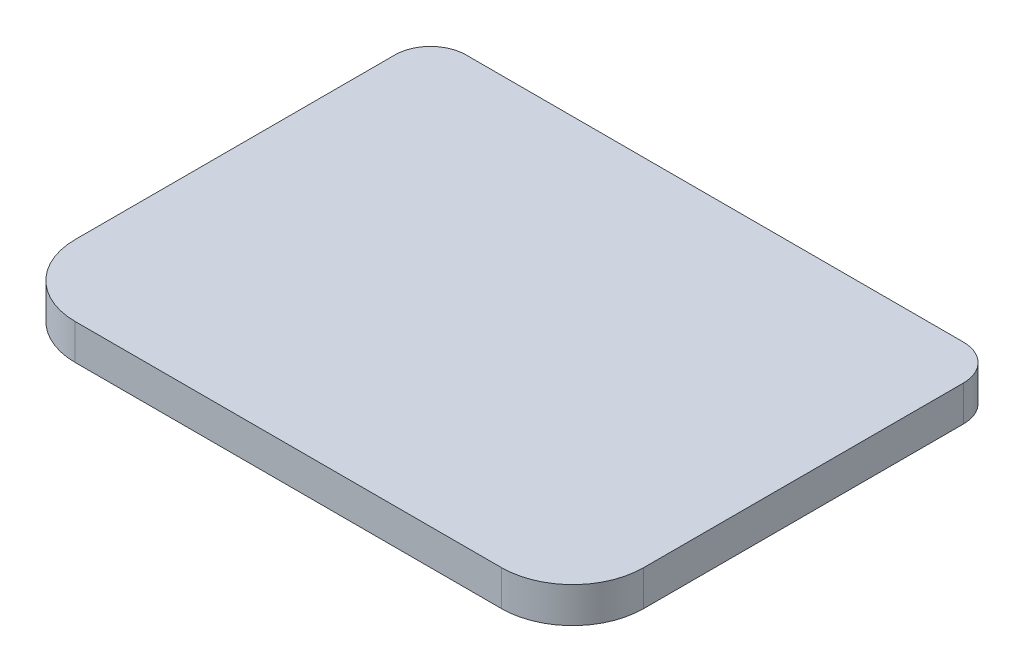
ISO-10303-21;
HEADER;
FILE_DESCRIPTION(('STEP AP214'),'2;1');
FILE_NAME('part.step','',(''),(''),'','','');
FILE_SCHEMA(('AUTOMOTIVE_DESIGN { 1 0 10303 214 1 1 1 1 }'));
ENDSEC;
DATA;
#1=APPLICATION_CONTEXT('core data for automotive mechanical design processes');
#2=APPLICATION_PROTOCOL_DEFINITION('international standard','automotive_design',2000,#1);
#3=PRODUCT_CONTEXT('',#1,'mechanical');
#4=PRODUCT('Part','Part','',(#3));
#5=PRODUCT_RELATED_PRODUCT_CATEGORY('part','',(#4));
#6=PRODUCT_DEFINITION_FORMATION('','',#4);
#7=PRODUCT_DEFINITION_CONTEXT('part definition',#1,'design');
#8=PRODUCT_DEFINITION('design','',#6,#7);
#9=PRODUCT_DEFINITION_SHAPE('','',#8);
#10=(LENGTH_UNIT() NAMED_UNIT(*) SI_UNIT(.MILLI.,.METRE.));
#11=(NAMED_UNIT(*) PLANE_ANGLE_UNIT() SI_UNIT($,.RADIAN.));
#12=(NAMED_UNIT(*) SI_UNIT($,.STERADIAN.) SOLID_ANGLE_UNIT());
#13=UNCERTAINTY_MEASURE_WITH_UNIT(LENGTH_MEASURE(1.E-05),#10,'distance_accuracy_value','');
#14=(GEOMETRIC_REPRESENTATION_CONTEXT(3) GLOBAL_UNCERTAINTY_ASSIGNED_CONTEXT((#13)) GLOBAL_UNIT_ASSIGNED_CONTEXT((#10,
#11,#12)) REPRESENTATION_CONTEXT('',''));
#15=CARTESIAN_POINT('',(0.,0.,0.));
#16=DIRECTION('',(0.,0.,1.));
#17=DIRECTION('',(1.,0.,0.));
#18=AXIS2_PLACEMENT_3D('',#15,#16,#17);
#19=CARTESIAN_POINT('',(25.4,3.175,-19.05));
#20=DIRECTION('',(-1.,0.,0.));
#21=DIRECTION('',(0.,0.,1.));
#22=AXIS2_PLACEMENT_3D('',#19,#20,#21);
#23=PLANE('',#22);
#24=DIRECTION('',(0.,0.,-1.));
#25=VECTOR('',#24,1.);
#26=CARTESIAN_POINT('',(25.4,0.,-19.05));
#27=LINE('',#26,#25);
#28=CARTESIAN_POINT('',(25.4,0.,12.7));
#29=VERTEX_POINT('',#28);
#30=CARTESIAN_POINT('',(25.4,0.,-15.875));
#31=VERTEX_POINT('',#30);
#32=EDGE_CURVE('E135',#29,#31,#27,.T.);
#33=ORIENTED_EDGE('',*,*,#32,.T.);
#34=DIRECTION('',(0.,-1.,0.));
#35=VECTOR('',#34,1.);
#36=CARTESIAN_POINT('',(25.4,3.175,-15.875));
#37=LINE('',#36,#35);
#38=CARTESIAN_POINT('',(25.4,3.175,-15.875));
#39=VERTEX_POINT('',#38);
#40=EDGE_CURVE('E72',#31,#39,#37,.F.);
#41=ORIENTED_EDGE('',*,*,#40,.T.);
#42=DIRECTION('',(0.,0.,-1.));
#43=VECTOR('',#42,1.);
#44=CARTESIAN_POINT('',(25.4,3.175,-19.05));
#45=LINE('',#44,#43);
#46=CARTESIAN_POINT('',(25.4,3.175,12.7));
#47=VERTEX_POINT('',#46);
#48=EDGE_CURVE('E136',#47,#39,#45,.T.);
#49=ORIENTED_EDGE('',*,*,#48,.F.);
#50=DIRECTION('',(0.,-1.,0.));
#51=VECTOR('',#50,1.);
#52=CARTESIAN_POINT('',(25.4,3.175,12.7));
#53=LINE('',#52,#51);
#54=EDGE_CURVE('E125',#47,#29,#53,.T.);
#55=ORIENTED_EDGE('',*,*,#54,.T.);
#56=EDGE_LOOP('',(#33,#41,#49,#55));
#57=FACE_BOUND('',#56,.T.);
#58=ADVANCED_FACE('F48',(#57),#23,.F.);
#59=CARTESIAN_POINT('',(-25.4,3.175,-19.05));
#60=DIRECTION('',(0.,0.,1.));
#61=DIRECTION('',(1.,0.,0.));
#62=AXIS2_PLACEMENT_3D('',#59,#60,#61);
#63=PLANE('',#62);
#64=DIRECTION('',(-1.,0.,0.));
#65=VECTOR('',#64,1.);
#66=CARTESIAN_POINT('',(-25.4,3.175,-19.05));
#67=LINE('',#66,#65);
#68=CARTESIAN_POINT('',(22.225,3.175,-19.05));
#69=VERTEX_POINT('',#68);
#70=CARTESIAN_POINT('',(-22.225,3.175,-19.05));
#71=VERTEX_POINT('',#70);
#72=EDGE_CURVE('E195',#69,#71,#67,.T.);
#73=ORIENTED_EDGE('',*,*,#72,.F.);
#74=DIRECTION('',(0.,-1.,0.));
#75=VECTOR('',#74,1.);
#76=CARTESIAN_POINT('',(22.225,3.175,-19.05));
#77=LINE('',#76,#75);
#78=CARTESIAN_POINT('',(22.225,0.,-19.05));
#79=VERTEX_POINT('',#78);
#80=EDGE_CURVE('E179',#69,#79,#77,.T.);
#81=ORIENTED_EDGE('',*,*,#80,.T.);
#82=DIRECTION('',(-1.,0.,0.));
#83=VECTOR('',#82,1.);
#84=CARTESIAN_POINT('',(-25.4,0.,-19.05));
#85=LINE('',#84,#83);
#86=CARTESIAN_POINT('',(-22.225,0.,-19.05));
#87=VERTEX_POINT('',#86);
#88=EDGE_CURVE('E144',#79,#87,#85,.T.);
#89=ORIENTED_EDGE('',*,*,#88,.T.);
#90=DIRECTION('',(0.,-1.,0.));
#91=VECTOR('',#90,1.);
#92=CARTESIAN_POINT('',(-22.225,3.175,-19.05));
#93=LINE('',#92,#91);
#94=EDGE_CURVE('E176',#87,#71,#93,.F.);
#95=ORIENTED_EDGE('',*,*,#94,.T.);
#96=EDGE_LOOP('',(#73,#81,#89,#95));
#97=FACE_BOUND('',#96,.T.);
#98=ADVANCED_FACE('F199',(#97),#63,.F.);
#99=CARTESIAN_POINT('',(-25.4,3.175,-19.05));
#100=DIRECTION('',(1.,0.,0.));
#101=DIRECTION('',(0.,0.,-1.));
#102=AXIS2_PLACEMENT_3D('',#99,#100,#101);
#103=PLANE('',#102);
#104=DIRECTION('',(0.,0.,1.));
#105=VECTOR('',#104,1.);
#106=CARTESIAN_POINT('',(-25.4,3.175,-19.05));
#107=LINE('',#106,#105);
#108=CARTESIAN_POINT('',(-25.4,3.175,-15.875));
#109=VERTEX_POINT('',#108);
#110=CARTESIAN_POINT('',(-25.4,3.175,12.7));
#111=VERTEX_POINT('',#110);
#112=EDGE_CURVE('E202',#109,#111,#107,.T.);
#113=ORIENTED_EDGE('',*,*,#112,.F.);
#114=DIRECTION('',(0.,-1.,0.));
#115=VECTOR('',#114,1.);
#116=CARTESIAN_POINT('',(-25.4,3.175,-15.875));
#117=LINE('',#116,#115);
#118=CARTESIAN_POINT('',(-25.4,0.,-15.875));
#119=VERTEX_POINT('',#118);
#120=EDGE_CURVE('E11',#109,#119,#117,.T.);
#121=ORIENTED_EDGE('',*,*,#120,.T.);
#122=DIRECTION('',(0.,0.,1.));
#123=VECTOR('',#122,1.);
#124=CARTESIAN_POINT('',(-25.4,0.,-19.05));
#125=LINE('',#124,#123);
#126=CARTESIAN_POINT('',(-25.4,0.,12.7));
#127=VERTEX_POINT('',#126);
#128=EDGE_CURVE('E148',#119,#127,#125,.T.);
#129=ORIENTED_EDGE('',*,*,#128,.T.);
#130=DIRECTION('',(0.,-1.,0.));
#131=VECTOR('',#130,1.);
#132=CARTESIAN_POINT('',(-25.4,3.175,12.7));
#133=LINE('',#132,#131);
#134=EDGE_CURVE('E172',#127,#111,#133,.F.);
#135=ORIENTED_EDGE('',*,*,#134,.T.);
#136=EDGE_LOOP('',(#113,#121,#129,#135));
#137=FACE_BOUND('',#136,.T.);
#138=ADVANCED_FACE('F220',(#137),#103,.F.);
#139=CARTESIAN_POINT('',(-25.4,3.175,19.05));
#140=DIRECTION('',(0.,0.,-1.));
#141=DIRECTION('',(-1.,0.,0.));
#142=AXIS2_PLACEMENT_3D('',#139,#140,#141);
#143=PLANE('',#142);
#144=DIRECTION('',(1.,0.,0.));
#145=VECTOR('',#144,1.);
#146=CARTESIAN_POINT('',(-25.4,0.,19.05));
#147=LINE('',#146,#145);
#148=CARTESIAN_POINT('',(-19.05,0.,19.05));
#149=VERTEX_POINT('',#148);
#150=CARTESIAN_POINT('',(19.05,0.,19.05));
#151=VERTEX_POINT('',#150);
#152=EDGE_CURVE('E155',#149,#151,#147,.T.);
#153=ORIENTED_EDGE('',*,*,#152,.T.);
#154=DIRECTION('',(0.,-1.,0.));
#155=VECTOR('',#154,1.);
#156=CARTESIAN_POINT('',(19.05,3.175,19.05));
#157=LINE('',#156,#155);
#158=CARTESIAN_POINT('',(19.05,3.175,19.05));
#159=VERTEX_POINT('',#158);
#160=EDGE_CURVE('E126',#151,#159,#157,.F.);
#161=ORIENTED_EDGE('',*,*,#160,.T.);
#162=DIRECTION('',(1.,0.,0.));
#163=VECTOR('',#162,1.);
#164=CARTESIAN_POINT('',(-25.4,3.175,19.05));
#165=LINE('',#164,#163);
#166=CARTESIAN_POINT('',(-19.05,3.175,19.05));
#167=VERTEX_POINT('',#166);
#168=EDGE_CURVE('E138',#167,#159,#165,.T.);
#169=ORIENTED_EDGE('',*,*,#168,.F.);
#170=DIRECTION('',(0.,-1.,0.));
#171=VECTOR('',#170,1.);
#172=CARTESIAN_POINT('',(-19.05,3.175,19.05));
#173=LINE('',#172,#171);
#174=EDGE_CURVE('E132',#167,#149,#173,.T.);
#175=ORIENTED_EDGE('',*,*,#174,.T.);
#176=EDGE_LOOP('',(#153,#161,#169,#175));
#177=FACE_BOUND('',#176,.T.);
#178=ADVANCED_FACE('F231',(#177),#143,.F.);
#179=CARTESIAN_POINT('',(0.,3.175,0.));
#180=DIRECTION('',(0.,1.,0.));
#181=DIRECTION('',(0.,0.,1.));
#182=AXIS2_PLACEMENT_3D('',#179,#180,#181);
#183=PLANE('',#182);
#184=ORIENTED_EDGE('',*,*,#48,.T.);
#185=CARTESIAN_POINT('',(22.225,3.175,-15.875));
#186=DIRECTION('',(0.,1.,0.));
#187=DIRECTION('',(0.,0.,1.));
#188=AXIS2_PLACEMENT_3D('',#185,#186,#187);
#189=CIRCLE('',#188,3.175);
#190=EDGE_CURVE('E57',#39,#69,#189,.T.);
#191=ORIENTED_EDGE('',*,*,#190,.T.);
#192=ORIENTED_EDGE('',*,*,#72,.T.);
#193=CARTESIAN_POINT('',(-22.225,3.175,-15.875));
#194=DIRECTION('',(0.,1.,0.));
#195=DIRECTION('',(0.,0.,1.));
#196=AXIS2_PLACEMENT_3D('',#193,#194,#195);
#197=CIRCLE('',#196,3.175);
#198=EDGE_CURVE('E64',#71,#109,#197,.T.);
#199=ORIENTED_EDGE('',*,*,#198,.T.);
#200=ORIENTED_EDGE('',*,*,#112,.T.);
#201=CARTESIAN_POINT('',(-19.05,3.175,12.7));
#202=DIRECTION('',(0.,1.,0.));
#203=DIRECTION('',(0.,0.,1.));
#204=AXIS2_PLACEMENT_3D('',#201,#202,#203);
#205=CIRCLE('',#204,6.35);
#206=EDGE_CURVE('E166',#111,#167,#205,.T.);
#207=ORIENTED_EDGE('',*,*,#206,.T.);
#208=ORIENTED_EDGE('',*,*,#168,.T.);
#209=CARTESIAN_POINT('',(19.05,3.175,12.7));
#210=DIRECTION('',(0.,1.,0.));
#211=DIRECTION('',(0.,0.,1.));
#212=AXIS2_PLACEMENT_3D('',#209,#210,#211);
#213=CIRCLE('',#212,6.35);
#214=EDGE_CURVE('E169',#159,#47,#213,.T.);
#215=ORIENTED_EDGE('',*,*,#214,.T.);
#216=EDGE_LOOP('',(#184,#191,#192,#199,#200,#207,#208,#215));
#217=FACE_BOUND('',#216,.T.);
#218=ADVANCED_FACE('F194',(#217),#183,.T.);
#219=CARTESIAN_POINT('',(0.,0.,0.));
#220=DIRECTION('',(0.,1.,0.));
#221=DIRECTION('',(0.,0.,1.));
#222=AXIS2_PLACEMENT_3D('',#219,#220,#221);
#223=PLANE('',#222);
#224=ORIENTED_EDGE('',*,*,#88,.F.);
#225=CARTESIAN_POINT('',(22.225,0.,-15.875));
#226=DIRECTION('',(0.,1.,0.));
#227=DIRECTION('',(0.,0.,1.));
#228=AXIS2_PLACEMENT_3D('',#225,#226,#227);
#229=CIRCLE('',#228,3.175);
#230=EDGE_CURVE('E142',#79,#31,#229,.F.);
#231=ORIENTED_EDGE('',*,*,#230,.T.);
#232=ORIENTED_EDGE('',*,*,#32,.F.);
#233=CARTESIAN_POINT('',(19.05,0.,12.7));
#234=DIRECTION('',(0.,1.,0.));
#235=DIRECTION('',(0.,0.,1.));
#236=AXIS2_PLACEMENT_3D('',#233,#234,#235);
#237=CIRCLE('',#236,6.35);
#238=EDGE_CURVE('E121',#29,#151,#237,.F.);
#239=ORIENTED_EDGE('',*,*,#238,.T.);
#240=ORIENTED_EDGE('',*,*,#152,.F.);
#241=CARTESIAN_POINT('',(-19.05,0.,12.7));
#242=DIRECTION('',(0.,1.,0.));
#243=DIRECTION('',(0.,0.,1.));
#244=AXIS2_PLACEMENT_3D('',#241,#242,#243);
#245=CIRCLE('',#244,6.35);
#246=EDGE_CURVE('E133',#149,#127,#245,.F.);
#247=ORIENTED_EDGE('',*,*,#246,.T.);
#248=ORIENTED_EDGE('',*,*,#128,.F.);
#249=CARTESIAN_POINT('',(-22.225,0.,-15.875));
#250=DIRECTION('',(0.,1.,0.));
#251=DIRECTION('',(0.,0.,1.));
#252=AXIS2_PLACEMENT_3D('',#249,#250,#251);
#253=CIRCLE('',#252,3.175);
#254=EDGE_CURVE('E183',#119,#87,#253,.F.);
#255=ORIENTED_EDGE('',*,*,#254,.T.);
#256=EDGE_LOOP('',(#224,#231,#232,#239,#240,#247,#248,#255));
#257=FACE_BOUND('',#256,.T.);
#258=ADVANCED_FACE('F141',(#257),#223,.F.);
#259=CARTESIAN_POINT('',(19.05,3.175,12.7));
#260=DIRECTION('',(0.,-1.,0.));
#261=DIRECTION('',(0.,0.,-1.));
#262=AXIS2_PLACEMENT_3D('',#259,#260,#261);
#263=CYLINDRICAL_SURFACE('',#262,6.35);
#264=ORIENTED_EDGE('',*,*,#214,.F.);
#265=ORIENTED_EDGE('',*,*,#160,.F.);
#266=ORIENTED_EDGE('',*,*,#238,.F.);
#267=ORIENTED_EDGE('',*,*,#54,.F.);
#268=EDGE_LOOP('',(#264,#265,#266,#267));
#269=FACE_BOUND('',#268,.T.);
#270=ADVANCED_FACE('F124',(#269),#263,.T.);
#271=CARTESIAN_POINT('',(-19.05,3.175,12.7));
#272=DIRECTION('',(0.,-1.,0.));
#273=DIRECTION('',(0.,0.,-1.));
#274=AXIS2_PLACEMENT_3D('',#271,#272,#273);
#275=CYLINDRICAL_SURFACE('',#274,6.35);
#276=ORIENTED_EDGE('',*,*,#206,.F.);
#277=ORIENTED_EDGE('',*,*,#134,.F.);
#278=ORIENTED_EDGE('',*,*,#246,.F.);
#279=ORIENTED_EDGE('',*,*,#174,.F.);
#280=EDGE_LOOP('',(#276,#277,#278,#279));
#281=FACE_BOUND('',#280,.T.);
#282=ADVANCED_FACE('F206',(#281),#275,.T.);
#283=CARTESIAN_POINT('',(22.225,3.175,-15.875));
#284=DIRECTION('',(0.,-1.,0.));
#285=DIRECTION('',(0.,0.,-1.));
#286=AXIS2_PLACEMENT_3D('',#283,#284,#285);
#287=CYLINDRICAL_SURFACE('',#286,3.175);
#288=ORIENTED_EDGE('',*,*,#190,.F.);
#289=ORIENTED_EDGE('',*,*,#40,.F.);
#290=ORIENTED_EDGE('',*,*,#230,.F.);
#291=ORIENTED_EDGE('',*,*,#80,.F.);
#292=EDGE_LOOP('',(#288,#289,#290,#291));
#293=FACE_BOUND('',#292,.T.);
#294=ADVANCED_FACE('F204',(#293),#287,.T.);
#295=CARTESIAN_POINT('',(-22.225,3.175,-15.875));
#296=DIRECTION('',(0.,-1.,0.));
#297=DIRECTION('',(0.,0.,-1.));
#298=AXIS2_PLACEMENT_3D('',#295,#296,#297);
#299=CYLINDRICAL_SURFACE('',#298,3.175);
#300=ORIENTED_EDGE('',*,*,#198,.F.);
#301=ORIENTED_EDGE('',*,*,#94,.F.);
#302=ORIENTED_EDGE('',*,*,#254,.F.);
#303=ORIENTED_EDGE('',*,*,#120,.F.);
#304=EDGE_LOOP('',(#300,#301,#302,#303));
#305=FACE_BOUND('',#304,.T.);
#306=ADVANCED_FACE('F50',(#305),#299,.T.);
#307=CLOSED_SHELL('',(#58,#98,#138,#178,#218,#258,#270,#282,#294,#306));
#308=MANIFOLD_SOLID_BREP('B2',#307);
#309=ADVANCED_BREP_SHAPE_REPRESENTATION('',(#18,#308),#14);
#310=SHAPE_DEFINITION_REPRESENTATION(#9,#309);
ENDSEC;
END-ISO-10303-21;
